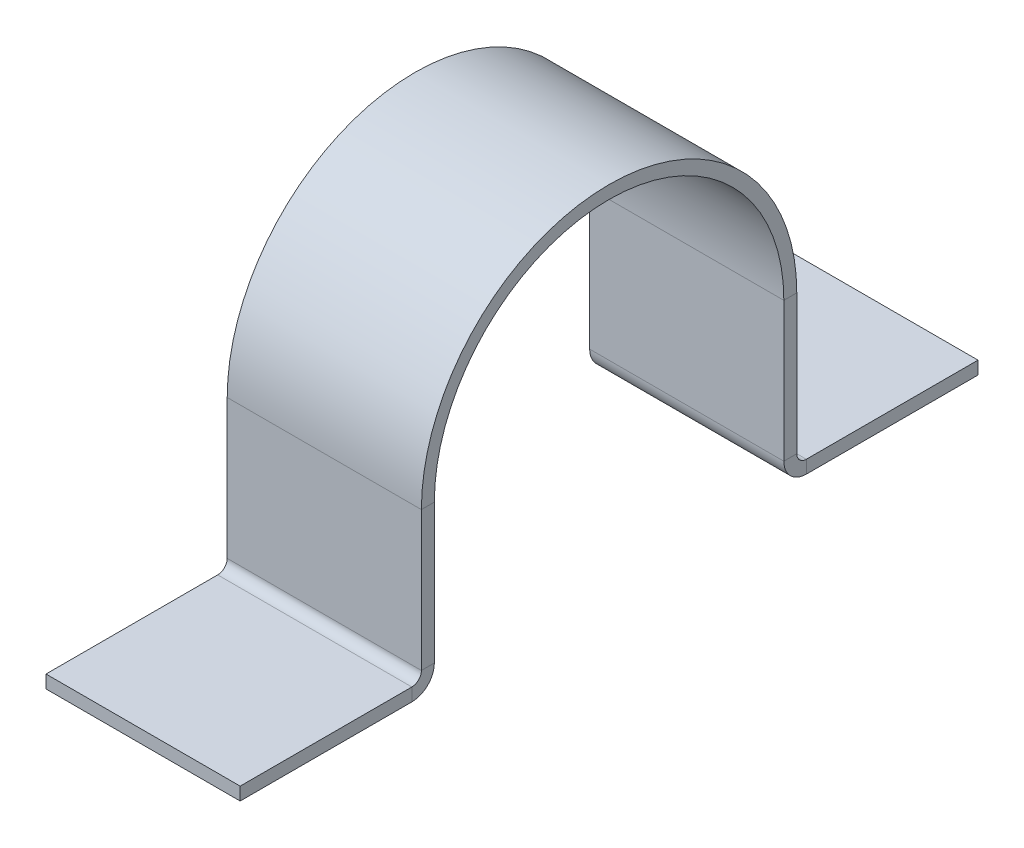
ISO-10303-21;
HEADER;
FILE_DESCRIPTION(('STEP AP214'),'2;1');
FILE_NAME('part.step','',(''),(''),'','','');
FILE_SCHEMA(('AUTOMOTIVE_DESIGN { 1 0 10303 214 1 1 1 1 }'));
ENDSEC;
DATA;
#1=APPLICATION_CONTEXT('core data for automotive mechanical design processes');
#2=APPLICATION_PROTOCOL_DEFINITION('international standard','automotive_design',2000,#1);
#3=PRODUCT_CONTEXT('',#1,'mechanical');
#4=PRODUCT('Part','Part','',(#3));
#5=PRODUCT_RELATED_PRODUCT_CATEGORY('part','',(#4));
#6=PRODUCT_DEFINITION_FORMATION('','',#4);
#7=PRODUCT_DEFINITION_CONTEXT('part definition',#1,'design');
#8=PRODUCT_DEFINITION('design','',#6,#7);
#9=PRODUCT_DEFINITION_SHAPE('','',#8);
#10=(LENGTH_UNIT() NAMED_UNIT(*) SI_UNIT(.MILLI.,.METRE.));
#11=(NAMED_UNIT(*) PLANE_ANGLE_UNIT() SI_UNIT($,.RADIAN.));
#12=(NAMED_UNIT(*) SI_UNIT($,.STERADIAN.) SOLID_ANGLE_UNIT());
#13=UNCERTAINTY_MEASURE_WITH_UNIT(LENGTH_MEASURE(1.E-05),#10,'distance_accuracy_value','');
#14=(GEOMETRIC_REPRESENTATION_CONTEXT(3) GLOBAL_UNCERTAINTY_ASSIGNED_CONTEXT((#13)) GLOBAL_UNIT_ASSIGNED_CONTEXT((#10,
#11,#12)) REPRESENTATION_CONTEXT('',''));
#15=CARTESIAN_POINT('',(0.,0.,0.));
#16=DIRECTION('',(0.,0.,1.));
#17=DIRECTION('',(1.,0.,0.));
#18=AXIS2_PLACEMENT_3D('',#15,#16,#17);
#19=CARTESIAN_POINT('',(7.5,4.57447073562823,10.5864398248652));
#20=DIRECTION('',(1.,0.,0.));
#21=DIRECTION('',(0.,0.,-1.));
#22=AXIS2_PLACEMENT_3D('',#19,#20,#21);
#23=PLANE('',#22);
#24=DIRECTION('',(0.,0.,1.));
#25=VECTOR('',#24,1.);
#26=CARTESIAN_POINT('',(7.5,4.57447073562823,10.5864398248652));
#27=LINE('',#26,#25);
#28=CARTESIAN_POINT('',(7.5,4.57447073562823,10.5864398248652));
#29=VERTEX_POINT('',#28);
#30=CARTESIAN_POINT('',(7.5,4.57447073562823,11.5864398248652));
#31=VERTEX_POINT('',#30);
#32=EDGE_CURVE('E11',#29,#31,#27,.T.);
#33=ORIENTED_EDGE('',*,*,#32,.F.);
#34=CARTESIAN_POINT('',(7.5,4.57447073562823,-2.91356017513478));
#35=DIRECTION('',(-1.,0.,0.));
#36=DIRECTION('',(0.,0.,1.));
#37=AXIS2_PLACEMENT_3D('',#34,#35,#36);
#38=CIRCLE('',#37,13.5);
#39=CARTESIAN_POINT('',(7.5,4.57447073562823,-16.4135601751348));
#40=VERTEX_POINT('',#39);
#41=EDGE_CURVE('E175',#29,#40,#38,.T.);
#42=ORIENTED_EDGE('',*,*,#41,.T.);
#43=DIRECTION('',(0.,0.,1.));
#44=VECTOR('',#43,1.);
#45=CARTESIAN_POINT('',(7.5,4.57447073562823,-17.4135601751348));
#46=LINE('',#45,#44);
#47=CARTESIAN_POINT('',(7.5,4.57447073562823,-17.4135601751348));
#48=VERTEX_POINT('',#47);
#49=EDGE_CURVE('E49',#48,#40,#46,.T.);
#50=ORIENTED_EDGE('',*,*,#49,.F.);
#51=CARTESIAN_POINT('',(7.5,4.57447073562823,-2.91356017513478));
#52=DIRECTION('',(1.,0.,0.));
#53=DIRECTION('',(0.,0.,-1.));
#54=AXIS2_PLACEMENT_3D('',#51,#52,#53);
#55=CIRCLE('',#54,14.5);
#56=EDGE_CURVE('E301',#31,#48,#55,.F.);
#57=ORIENTED_EDGE('',*,*,#56,.F.);
#58=EDGE_LOOP('',(#33,#42,#50,#57));
#59=FACE_BOUND('',#58,.T.);
#60=ADVANCED_FACE('F41',(#59),#23,.T.);
#61=CARTESIAN_POINT('',(7.5,4.57447073562823,-17.4135601751348));
#62=DIRECTION('',(1.,0.,0.));
#63=DIRECTION('',(0.,0.,-1.));
#64=AXIS2_PLACEMENT_3D('',#61,#62,#63);
#65=PLANE('',#64);
#66=DIRECTION('',(0.,1.,0.));
#67=VECTOR('',#66,1.);
#68=CARTESIAN_POINT('',(7.5,4.57447073562823,10.5864398248652));
#69=LINE('',#68,#67);
#70=CARTESIAN_POINT('',(7.5,-6.18892926437177,10.5864398248652));
#71=VERTEX_POINT('',#70);
#72=EDGE_CURVE('E180',#71,#29,#69,.T.);
#73=ORIENTED_EDGE('',*,*,#72,.T.);
#74=ORIENTED_EDGE('',*,*,#32,.T.);
#75=DIRECTION('',(0.,1.,0.));
#76=VECTOR('',#75,1.);
#77=CARTESIAN_POINT('',(7.5,4.57447073562823,11.5864398248652));
#78=LINE('',#77,#76);
#79=CARTESIAN_POINT('',(7.5,-6.18892926437177,11.5864398248652));
#80=VERTEX_POINT('',#79);
#81=EDGE_CURVE('E315',#80,#31,#78,.T.);
#82=ORIENTED_EDGE('',*,*,#81,.F.);
#83=DIRECTION('',(0.,0.,-1.));
#84=VECTOR('',#83,1.);
#85=CARTESIAN_POINT('',(7.5,-6.18892926437177,11.5864398248652));
#86=LINE('',#85,#84);
#87=EDGE_CURVE('E288',#80,#71,#86,.T.);
#88=ORIENTED_EDGE('',*,*,#87,.T.);
#89=EDGE_LOOP('',(#73,#74,#82,#88));
#90=FACE_BOUND('',#89,.T.);
#91=ADVANCED_FACE('F339',(#90),#65,.T.);
#92=CARTESIAN_POINT('',(-7.5,4.57447073562823,-16.4135601751348));
#93=DIRECTION('',(-1.,0.,0.));
#94=DIRECTION('',(0.,0.,1.));
#95=AXIS2_PLACEMENT_3D('',#92,#93,#94);
#96=PLANE('',#95);
#97=DIRECTION('',(0.,0.,-1.));
#98=VECTOR('',#97,1.);
#99=CARTESIAN_POINT('',(-7.5,4.57447073562823,-16.4135601751348));
#100=LINE('',#99,#98);
#101=CARTESIAN_POINT('',(-7.5,4.57447073562823,-16.4135601751348));
#102=VERTEX_POINT('',#101);
#103=CARTESIAN_POINT('',(-7.5,4.57447073562823,-17.4135601751348));
#104=VERTEX_POINT('',#103);
#105=EDGE_CURVE('E173',#102,#104,#100,.T.);
#106=ORIENTED_EDGE('',*,*,#105,.F.);
#107=CARTESIAN_POINT('',(-7.5,4.57447073562823,-2.91356017513478));
#108=DIRECTION('',(-1.,0.,0.));
#109=DIRECTION('',(0.,0.,1.));
#110=AXIS2_PLACEMENT_3D('',#107,#108,#109);
#111=CIRCLE('',#110,13.5);
#112=CARTESIAN_POINT('',(-7.5,4.57447073562823,10.5864398248652));
#113=VERTEX_POINT('',#112);
#114=EDGE_CURVE('E187',#113,#102,#111,.T.);
#115=ORIENTED_EDGE('',*,*,#114,.F.);
#116=DIRECTION('',(0.,0.,-1.));
#117=VECTOR('',#116,1.);
#118=CARTESIAN_POINT('',(-7.5,4.57447073562823,11.5864398248652));
#119=LINE('',#118,#117);
#120=CARTESIAN_POINT('',(-7.5,4.57447073562823,11.5864398248652));
#121=VERTEX_POINT('',#120);
#122=EDGE_CURVE('E292',#121,#113,#119,.T.);
#123=ORIENTED_EDGE('',*,*,#122,.F.);
#124=CARTESIAN_POINT('',(-7.5,4.57447073562823,-2.91356017513478));
#125=DIRECTION('',(1.,0.,0.));
#126=DIRECTION('',(0.,0.,-1.));
#127=AXIS2_PLACEMENT_3D('',#124,#125,#126);
#128=CIRCLE('',#127,14.5);
#129=EDGE_CURVE('E214',#121,#104,#128,.F.);
#130=ORIENTED_EDGE('',*,*,#129,.T.);
#131=EDGE_LOOP('',(#106,#115,#123,#130));
#132=FACE_BOUND('',#131,.T.);
#133=ADVANCED_FACE('F306',(#132),#96,.T.);
#134=CARTESIAN_POINT('',(-7.5,4.57447073562823,11.5864398248652));
#135=DIRECTION('',(-1.,0.,0.));
#136=DIRECTION('',(0.,0.,1.));
#137=AXIS2_PLACEMENT_3D('',#134,#135,#136);
#138=PLANE('',#137);
#139=DIRECTION('',(0.,-1.,0.));
#140=VECTOR('',#139,1.);
#141=CARTESIAN_POINT('',(-7.5,4.57447073562823,-16.4135601751348));
#142=LINE('',#141,#140);
#143=CARTESIAN_POINT('',(-7.5,-6.18892926437177,-16.4135601751348));
#144=VERTEX_POINT('',#143);
#145=EDGE_CURVE('E239',#102,#144,#142,.T.);
#146=ORIENTED_EDGE('',*,*,#145,.F.);
#147=ORIENTED_EDGE('',*,*,#105,.T.);
#148=DIRECTION('',(0.,-1.,0.));
#149=VECTOR('',#148,1.);
#150=CARTESIAN_POINT('',(-7.5,4.57447073562823,-17.4135601751348));
#151=LINE('',#150,#149);
#152=CARTESIAN_POINT('',(-7.5,-6.18892926437177,-17.4135601751348));
#153=VERTEX_POINT('',#152);
#154=EDGE_CURVE('E212',#104,#153,#151,.T.);
#155=ORIENTED_EDGE('',*,*,#154,.T.);
#156=DIRECTION('',(0.,0.,1.));
#157=VECTOR('',#156,1.);
#158=CARTESIAN_POINT('',(-7.5,-6.18892926437177,-17.4135601751348));
#159=LINE('',#158,#157);
#160=EDGE_CURVE('E110',#153,#144,#159,.T.);
#161=ORIENTED_EDGE('',*,*,#160,.T.);
#162=EDGE_LOOP('',(#146,#147,#155,#161));
#163=FACE_BOUND('',#162,.T.);
#164=ADVANCED_FACE('F294',(#163),#138,.T.);
#165=CARTESIAN_POINT('',(7.5,-7.92552926437177,12.3230398248652));
#166=DIRECTION('',(1.,0.,0.));
#167=DIRECTION('',(0.,0.,-1.));
#168=AXIS2_PLACEMENT_3D('',#165,#166,#167);
#169=PLANE('',#168);
#170=DIRECTION('',(0.,1.,0.));
#171=VECTOR('',#170,1.);
#172=CARTESIAN_POINT('',(7.5,-7.92552926437177,12.3230398248652));
#173=LINE('',#172,#171);
#174=CARTESIAN_POINT('',(7.5,-7.92552926437177,12.3230398248652));
#175=VERTEX_POINT('',#174);
#176=CARTESIAN_POINT('',(7.5,-6.92552926437177,12.3230398248652));
#177=VERTEX_POINT('',#176);
#178=EDGE_CURVE('E290',#175,#177,#173,.T.);
#179=ORIENTED_EDGE('',*,*,#178,.F.);
#180=CARTESIAN_POINT('',(7.5,-6.18892926437177,12.3230398248652));
#181=DIRECTION('',(-1.,0.,0.));
#182=DIRECTION('',(0.,0.,1.));
#183=AXIS2_PLACEMENT_3D('',#180,#181,#182);
#184=CIRCLE('',#183,1.7366);
#185=EDGE_CURVE('E334',#175,#71,#184,.F.);
#186=ORIENTED_EDGE('',*,*,#185,.T.);
#187=ORIENTED_EDGE('',*,*,#87,.F.);
#188=CARTESIAN_POINT('',(7.5,-6.18892926437177,12.3230398248652));
#189=DIRECTION('',(1.,0.,0.));
#190=DIRECTION('',(0.,0.,-1.));
#191=AXIS2_PLACEMENT_3D('',#188,#189,#190);
#192=CIRCLE('',#191,0.7366);
#193=EDGE_CURVE('E317',#177,#80,#192,.T.);
#194=ORIENTED_EDGE('',*,*,#193,.F.);
#195=EDGE_LOOP('',(#179,#186,#187,#194));
#196=FACE_BOUND('',#195,.T.);
#197=ADVANCED_FACE('F352',(#196),#169,.T.);
#198=CARTESIAN_POINT('',(7.5,-6.18892926437177,11.5864398248652));
#199=DIRECTION('',(1.,0.,0.));
#200=DIRECTION('',(0.,0.,-1.));
#201=AXIS2_PLACEMENT_3D('',#198,#199,#200);
#202=PLANE('',#201);
#203=DIRECTION('',(0.,0.,-1.));
#204=VECTOR('',#203,1.);
#205=CARTESIAN_POINT('',(7.5,-7.92552926437177,10.5864398248652));
#206=LINE('',#205,#204);
#207=CARTESIAN_POINT('',(7.5,-7.92552926437178,25.5864398248652));
#208=VERTEX_POINT('',#207);
#209=EDGE_CURVE('E331',#208,#175,#206,.T.);
#210=ORIENTED_EDGE('',*,*,#209,.T.);
#211=ORIENTED_EDGE('',*,*,#178,.T.);
#212=DIRECTION('',(0.,0.,-1.));
#213=VECTOR('',#212,1.);
#214=CARTESIAN_POINT('',(7.5,-6.92552926437177,10.5864398248652));
#215=LINE('',#214,#213);
#216=CARTESIAN_POINT('',(7.5,-6.92552926437178,25.5864398248652));
#217=VERTEX_POINT('',#216);
#218=EDGE_CURVE('E325',#217,#177,#215,.T.);
#219=ORIENTED_EDGE('',*,*,#218,.F.);
#220=DIRECTION('',(0.,1.,0.));
#221=VECTOR('',#220,1.);
#222=CARTESIAN_POINT('',(7.5,-7.92552926437178,25.5864398248652));
#223=LINE('',#222,#221);
#224=EDGE_CURVE('E328',#208,#217,#223,.T.);
#225=ORIENTED_EDGE('',*,*,#224,.F.);
#226=EDGE_LOOP('',(#210,#211,#219,#225));
#227=FACE_BOUND('',#226,.T.);
#228=ADVANCED_FACE('F359',(#227),#202,.T.);
#229=CARTESIAN_POINT('',(-7.5,-6.18892926437177,10.5864398248652));
#230=DIRECTION('',(-1.,0.,0.));
#231=DIRECTION('',(0.,0.,1.));
#232=AXIS2_PLACEMENT_3D('',#229,#230,#231);
#233=PLANE('',#232);
#234=DIRECTION('',(0.,0.,1.));
#235=VECTOR('',#234,1.);
#236=CARTESIAN_POINT('',(-7.5,-6.18892926437177,10.5864398248652));
#237=LINE('',#236,#235);
#238=CARTESIAN_POINT('',(-7.5,-6.18892926437177,10.5864398248652));
#239=VERTEX_POINT('',#238);
#240=CARTESIAN_POINT('',(-7.5,-6.18892926437177,11.5864398248652));
#241=VERTEX_POINT('',#240);
#242=EDGE_CURVE('E286',#239,#241,#237,.T.);
#243=ORIENTED_EDGE('',*,*,#242,.F.);
#244=CARTESIAN_POINT('',(-7.5,-6.18892926437177,12.3230398248652));
#245=DIRECTION('',(-1.,0.,0.));
#246=DIRECTION('',(0.,0.,1.));
#247=AXIS2_PLACEMENT_3D('',#244,#245,#246);
#248=CIRCLE('',#247,1.7366);
#249=CARTESIAN_POINT('',(-7.5,-7.92552926437177,12.3230398248652));
#250=VERTEX_POINT('',#249);
#251=EDGE_CURVE('E232',#250,#239,#248,.F.);
#252=ORIENTED_EDGE('',*,*,#251,.F.);
#253=DIRECTION('',(0.,-1.,0.));
#254=VECTOR('',#253,1.);
#255=CARTESIAN_POINT('',(-7.5,-6.92552926437177,12.3230398248652));
#256=LINE('',#255,#254);
#257=CARTESIAN_POINT('',(-7.5,-6.92552926437177,12.3230398248652));
#258=VERTEX_POINT('',#257);
#259=EDGE_CURVE('E284',#258,#250,#256,.T.);
#260=ORIENTED_EDGE('',*,*,#259,.F.);
#261=CARTESIAN_POINT('',(-7.5,-6.18892926437177,12.3230398248652));
#262=DIRECTION('',(1.,0.,0.));
#263=DIRECTION('',(0.,0.,-1.));
#264=AXIS2_PLACEMENT_3D('',#261,#262,#263);
#265=CIRCLE('',#264,0.7366);
#266=EDGE_CURVE('E220',#258,#241,#265,.T.);
#267=ORIENTED_EDGE('',*,*,#266,.T.);
#268=EDGE_LOOP('',(#243,#252,#260,#267));
#269=FACE_BOUND('',#268,.T.);
#270=ADVANCED_FACE('F371',(#269),#233,.T.);
#271=CARTESIAN_POINT('',(-7.5,-6.92552926437177,12.3230398248652));
#272=DIRECTION('',(-1.,0.,0.));
#273=DIRECTION('',(0.,0.,1.));
#274=AXIS2_PLACEMENT_3D('',#271,#272,#273);
#275=PLANE('',#274);
#276=DIRECTION('',(0.,1.,0.));
#277=VECTOR('',#276,1.);
#278=CARTESIAN_POINT('',(-7.5,4.57447073562823,10.5864398248652));
#279=LINE('',#278,#277);
#280=EDGE_CURVE('E235',#239,#113,#279,.T.);
#281=ORIENTED_EDGE('',*,*,#280,.F.);
#282=ORIENTED_EDGE('',*,*,#242,.T.);
#283=DIRECTION('',(0.,1.,0.));
#284=VECTOR('',#283,1.);
#285=CARTESIAN_POINT('',(-7.5,4.57447073562823,11.5864398248652));
#286=LINE('',#285,#284);
#287=EDGE_CURVE('E217',#241,#121,#286,.T.);
#288=ORIENTED_EDGE('',*,*,#287,.T.);
#289=ORIENTED_EDGE('',*,*,#122,.T.);
#290=EDGE_LOOP('',(#281,#282,#288,#289));
#291=FACE_BOUND('',#290,.T.);
#292=ADVANCED_FACE('F343',(#291),#275,.T.);
#293=CARTESIAN_POINT('',(7.5,-6.18892926437177,-16.4135601751348));
#294=DIRECTION('',(1.,0.,0.));
#295=DIRECTION('',(0.,0.,-1.));
#296=AXIS2_PLACEMENT_3D('',#293,#294,#295);
#297=PLANE('',#296);
#298=DIRECTION('',(0.,0.,-1.));
#299=VECTOR('',#298,1.);
#300=CARTESIAN_POINT('',(7.5,-6.18892926437177,-16.4135601751348));
#301=LINE('',#300,#299);
#302=CARTESIAN_POINT('',(7.5,-6.18892926437177,-16.4135601751348));
#303=VERTEX_POINT('',#302);
#304=CARTESIAN_POINT('',(7.5,-6.18892926437177,-17.4135601751348));
#305=VERTEX_POINT('',#304);
#306=EDGE_CURVE('E282',#303,#305,#301,.T.);
#307=ORIENTED_EDGE('',*,*,#306,.F.);
#308=CARTESIAN_POINT('',(7.5,-6.18892926437177,-18.1501601751348));
#309=DIRECTION('',(-1.,0.,0.));
#310=DIRECTION('',(0.,0.,1.));
#311=AXIS2_PLACEMENT_3D('',#308,#309,#310);
#312=CIRCLE('',#311,1.7366);
#313=CARTESIAN_POINT('',(7.5,-7.92552926437177,-18.1501601751348));
#314=VERTEX_POINT('',#313);
#315=EDGE_CURVE('E195',#303,#314,#312,.F.);
#316=ORIENTED_EDGE('',*,*,#315,.T.);
#317=DIRECTION('',(0.,-1.,0.));
#318=VECTOR('',#317,1.);
#319=CARTESIAN_POINT('',(7.5,-6.92552926437177,-18.1501601751348));
#320=LINE('',#319,#318);
#321=CARTESIAN_POINT('',(7.5,-6.92552926437177,-18.1501601751348));
#322=VERTEX_POINT('',#321);
#323=EDGE_CURVE('E57',#322,#314,#320,.T.);
#324=ORIENTED_EDGE('',*,*,#323,.F.);
#325=CARTESIAN_POINT('',(7.5,-6.18892926437177,-18.1501601751348));
#326=DIRECTION('',(1.,0.,0.));
#327=DIRECTION('',(0.,0.,-1.));
#328=AXIS2_PLACEMENT_3D('',#325,#326,#327);
#329=CIRCLE('',#328,0.7366);
#330=EDGE_CURVE('E319',#305,#322,#329,.T.);
#331=ORIENTED_EDGE('',*,*,#330,.F.);
#332=EDGE_LOOP('',(#307,#316,#324,#331));
#333=FACE_BOUND('',#332,.T.);
#334=ADVANCED_FACE('F402',(#333),#297,.T.);
#335=CARTESIAN_POINT('',(7.5,-6.92552926437177,-18.1501601751348));
#336=DIRECTION('',(1.,0.,0.));
#337=DIRECTION('',(0.,0.,-1.));
#338=AXIS2_PLACEMENT_3D('',#335,#336,#337);
#339=PLANE('',#338);
#340=DIRECTION('',(0.,-1.,0.));
#341=VECTOR('',#340,1.);
#342=CARTESIAN_POINT('',(7.5,4.57447073562823,-16.4135601751348));
#343=LINE('',#342,#341);
#344=EDGE_CURVE('E165',#40,#303,#343,.T.);
#345=ORIENTED_EDGE('',*,*,#344,.T.);
#346=ORIENTED_EDGE('',*,*,#306,.T.);
#347=DIRECTION('',(0.,-1.,0.));
#348=VECTOR('',#347,1.);
#349=CARTESIAN_POINT('',(7.5,4.57447073562823,-17.4135601751348));
#350=LINE('',#349,#348);
#351=EDGE_CURVE('E168',#48,#305,#350,.T.);
#352=ORIENTED_EDGE('',*,*,#351,.F.);
#353=ORIENTED_EDGE('',*,*,#49,.T.);
#354=EDGE_LOOP('',(#345,#346,#352,#353));
#355=FACE_BOUND('',#354,.T.);
#356=ADVANCED_FACE('F163',(#355),#339,.T.);
#357=CARTESIAN_POINT('',(-7.5,-7.92552926437177,-18.1501601751348));
#358=DIRECTION('',(-1.,0.,0.));
#359=DIRECTION('',(0.,0.,1.));
#360=AXIS2_PLACEMENT_3D('',#357,#358,#359);
#361=PLANE('',#360);
#362=DIRECTION('',(0.,1.,0.));
#363=VECTOR('',#362,1.);
#364=CARTESIAN_POINT('',(-7.5,-7.92552926437177,-18.1501601751348));
#365=LINE('',#364,#363);
#366=CARTESIAN_POINT('',(-7.5,-7.92552926437177,-18.1501601751348));
#367=VERTEX_POINT('',#366);
#368=CARTESIAN_POINT('',(-7.5,-6.92552926437177,-18.1501601751348));
#369=VERTEX_POINT('',#368);
#370=EDGE_CURVE('E117',#367,#369,#365,.T.);
#371=ORIENTED_EDGE('',*,*,#370,.F.);
#372=CARTESIAN_POINT('',(-7.5,-6.18892926437177,-18.1501601751348));
#373=DIRECTION('',(-1.,0.,0.));
#374=DIRECTION('',(0.,0.,1.));
#375=AXIS2_PLACEMENT_3D('',#372,#373,#374);
#376=CIRCLE('',#375,1.7366);
#377=EDGE_CURVE('E241',#144,#367,#376,.F.);
#378=ORIENTED_EDGE('',*,*,#377,.F.);
#379=ORIENTED_EDGE('',*,*,#160,.F.);
#380=CARTESIAN_POINT('',(-7.5,-6.18892926437177,-18.1501601751348));
#381=DIRECTION('',(1.,0.,0.));
#382=DIRECTION('',(0.,0.,-1.));
#383=AXIS2_PLACEMENT_3D('',#380,#381,#382);
#384=CIRCLE('',#383,0.7366);
#385=EDGE_CURVE('E210',#153,#369,#384,.T.);
#386=ORIENTED_EDGE('',*,*,#385,.T.);
#387=EDGE_LOOP('',(#371,#378,#379,#386));
#388=FACE_BOUND('',#387,.T.);
#389=ADVANCED_FACE('F408',(#388),#361,.T.);
#390=CARTESIAN_POINT('',(-7.5,-6.18892926437177,-17.4135601751348));
#391=DIRECTION('',(-1.,0.,0.));
#392=DIRECTION('',(0.,0.,1.));
#393=AXIS2_PLACEMENT_3D('',#390,#391,#392);
#394=PLANE('',#393);
#395=DIRECTION('',(0.,0.,-1.));
#396=VECTOR('',#395,1.);
#397=CARTESIAN_POINT('',(-7.5,-7.92552926437177,-16.4135601751348));
#398=LINE('',#397,#396);
#399=CARTESIAN_POINT('',(-7.5,-7.92552926437177,-31.4135601751348));
#400=VERTEX_POINT('',#399);
#401=EDGE_CURVE('E201',#367,#400,#398,.T.);
#402=ORIENTED_EDGE('',*,*,#401,.F.);
#403=ORIENTED_EDGE('',*,*,#370,.T.);
#404=DIRECTION('',(0.,0.,-1.));
#405=VECTOR('',#404,1.);
#406=CARTESIAN_POINT('',(-7.5,-6.92552926437177,-16.4135601751348));
#407=LINE('',#406,#405);
#408=CARTESIAN_POINT('',(-7.5,-6.92552926437177,-31.4135601751348));
#409=VERTEX_POINT('',#408);
#410=EDGE_CURVE('E207',#369,#409,#407,.T.);
#411=ORIENTED_EDGE('',*,*,#410,.T.);
#412=DIRECTION('',(0.,-1.,0.));
#413=VECTOR('',#412,1.);
#414=CARTESIAN_POINT('',(-7.5,-6.92552926437177,-31.4135601751348));
#415=LINE('',#414,#413);
#416=EDGE_CURVE('E204',#409,#400,#415,.T.);
#417=ORIENTED_EDGE('',*,*,#416,.T.);
#418=EDGE_LOOP('',(#402,#403,#411,#417));
#419=FACE_BOUND('',#418,.T.);
#420=ADVANCED_FACE('F411',(#419),#394,.T.);
#421=CARTESIAN_POINT('',(7.5,-7.92552926437177,-16.4135601751348));
#422=DIRECTION('',(0.,1.,0.));
#423=DIRECTION('',(0.,0.,1.));
#424=AXIS2_PLACEMENT_3D('',#421,#422,#423);
#425=PLANE('',#424);
#426=ORIENTED_EDGE('',*,*,#401,.T.);
#427=DIRECTION('',(-1.,0.,0.));
#428=VECTOR('',#427,1.);
#429=CARTESIAN_POINT('',(7.5,-7.92552926437177,-31.4135601751348));
#430=LINE('',#429,#428);
#431=CARTESIAN_POINT('',(7.5,-7.92552926437177,-31.4135601751348));
#432=VERTEX_POINT('',#431);
#433=EDGE_CURVE('E277',#432,#400,#430,.T.);
#434=ORIENTED_EDGE('',*,*,#433,.F.);
#435=DIRECTION('',(0.,0.,-1.));
#436=VECTOR('',#435,1.);
#437=CARTESIAN_POINT('',(7.5,-7.92552926437177,-16.4135601751348));
#438=LINE('',#437,#436);
#439=EDGE_CURVE('E123',#314,#432,#438,.T.);
#440=ORIENTED_EDGE('',*,*,#439,.F.);
#441=DIRECTION('',(-1.,0.,0.));
#442=VECTOR('',#441,1.);
#443=CARTESIAN_POINT('',(7.5,-7.92552926437177,-18.1501601751348));
#444=LINE('',#443,#442);
#445=EDGE_CURVE('E197',#314,#367,#444,.T.);
#446=ORIENTED_EDGE('',*,*,#445,.T.);
#447=EDGE_LOOP('',(#426,#434,#440,#446));
#448=FACE_BOUND('',#447,.T.);
#449=ADVANCED_FACE('F414',(#448),#425,.F.);
#450=CARTESIAN_POINT('',(7.5,-6.92552926437177,-31.4135601751348));
#451=DIRECTION('',(0.,0.,-1.));
#452=DIRECTION('',(-1.,0.,0.));
#453=AXIS2_PLACEMENT_3D('',#450,#451,#452);
#454=PLANE('',#453);
#455=ORIENTED_EDGE('',*,*,#416,.F.);
#456=DIRECTION('',(-1.,0.,0.));
#457=VECTOR('',#456,1.);
#458=CARTESIAN_POINT('',(7.5,-6.92552926437177,-31.4135601751348));
#459=LINE('',#458,#457);
#460=CARTESIAN_POINT('',(7.5,-6.92552926437177,-31.4135601751348));
#461=VERTEX_POINT('',#460);
#462=EDGE_CURVE('E275',#461,#409,#459,.T.);
#463=ORIENTED_EDGE('',*,*,#462,.F.);
#464=DIRECTION('',(0.,-1.,0.));
#465=VECTOR('',#464,1.);
#466=CARTESIAN_POINT('',(7.5,-6.92552926437177,-31.4135601751348));
#467=LINE('',#466,#465);
#468=EDGE_CURVE('E461',#461,#432,#467,.T.);
#469=ORIENTED_EDGE('',*,*,#468,.T.);
#470=ORIENTED_EDGE('',*,*,#433,.T.);
#471=EDGE_LOOP('',(#455,#463,#469,#470));
#472=FACE_BOUND('',#471,.T.);
#473=ADVANCED_FACE('F418',(#472),#454,.T.);
#474=CARTESIAN_POINT('',(7.5,-6.92552926437177,-16.4135601751348));
#475=DIRECTION('',(0.,1.,0.));
#476=DIRECTION('',(0.,0.,1.));
#477=AXIS2_PLACEMENT_3D('',#474,#475,#476);
#478=PLANE('',#477);
#479=ORIENTED_EDGE('',*,*,#410,.F.);
#480=DIRECTION('',(-1.,0.,0.));
#481=VECTOR('',#480,1.);
#482=CARTESIAN_POINT('',(7.5,-6.92552926437177,-18.1501601751348));
#483=LINE('',#482,#481);
#484=EDGE_CURVE('E272',#322,#369,#483,.T.);
#485=ORIENTED_EDGE('',*,*,#484,.F.);
#486=DIRECTION('',(0.,0.,-1.));
#487=VECTOR('',#486,1.);
#488=CARTESIAN_POINT('',(7.5,-6.92552926437177,-16.4135601751348));
#489=LINE('',#488,#487);
#490=EDGE_CURVE('E463',#322,#461,#489,.T.);
#491=ORIENTED_EDGE('',*,*,#490,.T.);
#492=ORIENTED_EDGE('',*,*,#462,.T.);
#493=EDGE_LOOP('',(#479,#485,#491,#492));
#494=FACE_BOUND('',#493,.T.);
#495=ADVANCED_FACE('F422',(#494),#478,.T.);
#496=CARTESIAN_POINT('',(7.5,-6.18892926437177,-18.1501601751348));
#497=DIRECTION('',(-1.,0.,0.));
#498=DIRECTION('',(0.,0.,1.));
#499=AXIS2_PLACEMENT_3D('',#496,#497,#498);
#500=CYLINDRICAL_SURFACE('',#499,0.7366);
#501=ORIENTED_EDGE('',*,*,#385,.F.);
#502=DIRECTION('',(-1.,0.,0.));
#503=VECTOR('',#502,1.);
#504=CARTESIAN_POINT('',(7.5,-6.18892926437177,-17.4135601751348));
#505=LINE('',#504,#503);
#506=EDGE_CURVE('E269',#305,#153,#505,.T.);
#507=ORIENTED_EDGE('',*,*,#506,.F.);
#508=ORIENTED_EDGE('',*,*,#330,.T.);
#509=ORIENTED_EDGE('',*,*,#484,.T.);
#510=EDGE_LOOP('',(#501,#507,#508,#509));
#511=FACE_BOUND('',#510,.T.);
#512=ADVANCED_FACE('F426',(#511),#500,.F.);
#513=CARTESIAN_POINT('',(7.5,4.57447073562823,-17.4135601751348));
#514=DIRECTION('',(0.,0.,-1.));
#515=DIRECTION('',(0.,1.,0.));
#516=AXIS2_PLACEMENT_3D('',#513,#514,#515);
#517=PLANE('',#516);
#518=ORIENTED_EDGE('',*,*,#154,.F.);
#519=DIRECTION('',(-1.,0.,0.));
#520=VECTOR('',#519,1.);
#521=CARTESIAN_POINT('',(7.5,4.57447073562823,-17.4135601751348));
#522=LINE('',#521,#520);
#523=EDGE_CURVE('E266',#48,#104,#522,.T.);
#524=ORIENTED_EDGE('',*,*,#523,.F.);
#525=ORIENTED_EDGE('',*,*,#351,.T.);
#526=ORIENTED_EDGE('',*,*,#506,.T.);
#527=EDGE_LOOP('',(#518,#524,#525,#526));
#528=FACE_BOUND('',#527,.T.);
#529=ADVANCED_FACE('F303',(#528),#517,.T.);
#530=CARTESIAN_POINT('',(7.5,4.57447073562823,-2.91356017513478));
#531=DIRECTION('',(-1.,0.,0.));
#532=DIRECTION('',(0.,0.,1.));
#533=AXIS2_PLACEMENT_3D('',#530,#531,#532);
#534=CYLINDRICAL_SURFACE('',#533,14.5);
#535=ORIENTED_EDGE('',*,*,#129,.F.);
#536=DIRECTION('',(-1.,0.,0.));
#537=VECTOR('',#536,1.);
#538=CARTESIAN_POINT('',(7.5,4.57447073562823,11.5864398248652));
#539=LINE('',#538,#537);
#540=EDGE_CURVE('E263',#31,#121,#539,.T.);
#541=ORIENTED_EDGE('',*,*,#540,.F.);
#542=ORIENTED_EDGE('',*,*,#56,.T.);
#543=ORIENTED_EDGE('',*,*,#523,.T.);
#544=EDGE_LOOP('',(#535,#541,#542,#543));
#545=FACE_BOUND('',#544,.T.);
#546=ADVANCED_FACE('F299',(#545),#534,.T.);
#547=CARTESIAN_POINT('',(7.5,4.57447073562823,11.5864398248652));
#548=DIRECTION('',(0.,0.,1.));
#549=DIRECTION('',(1.,0.,0.));
#550=AXIS2_PLACEMENT_3D('',#547,#548,#549);
#551=PLANE('',#550);
#552=ORIENTED_EDGE('',*,*,#287,.F.);
#553=DIRECTION('',(-1.,0.,0.));
#554=VECTOR('',#553,1.);
#555=CARTESIAN_POINT('',(7.5,-6.18892926437177,11.5864398248652));
#556=LINE('',#555,#554);
#557=EDGE_CURVE('E260',#80,#241,#556,.T.);
#558=ORIENTED_EDGE('',*,*,#557,.F.);
#559=ORIENTED_EDGE('',*,*,#81,.T.);
#560=ORIENTED_EDGE('',*,*,#540,.T.);
#561=EDGE_LOOP('',(#552,#558,#559,#560));
#562=FACE_BOUND('',#561,.T.);
#563=ADVANCED_FACE('F312',(#562),#551,.T.);
#564=CARTESIAN_POINT('',(7.5,-6.18892926437177,12.3230398248652));
#565=DIRECTION('',(-1.,0.,0.));
#566=DIRECTION('',(0.,0.,1.));
#567=AXIS2_PLACEMENT_3D('',#564,#565,#566);
#568=CYLINDRICAL_SURFACE('',#567,0.7366);
#569=ORIENTED_EDGE('',*,*,#266,.F.);
#570=DIRECTION('',(-1.,0.,0.));
#571=VECTOR('',#570,1.);
#572=CARTESIAN_POINT('',(7.5,-6.92552926437177,12.3230398248652));
#573=LINE('',#572,#571);
#574=EDGE_CURVE('E257',#177,#258,#573,.T.);
#575=ORIENTED_EDGE('',*,*,#574,.F.);
#576=ORIENTED_EDGE('',*,*,#193,.T.);
#577=ORIENTED_EDGE('',*,*,#557,.T.);
#578=EDGE_LOOP('',(#569,#575,#576,#577));
#579=FACE_BOUND('',#578,.T.);
#580=ADVANCED_FACE('F348',(#579),#568,.F.);
#581=CARTESIAN_POINT('',(7.5,-6.92552926437177,10.5864398248652));
#582=DIRECTION('',(0.,1.,0.));
#583=DIRECTION('',(0.,0.,1.));
#584=AXIS2_PLACEMENT_3D('',#581,#582,#583);
#585=PLANE('',#584);
#586=DIRECTION('',(0.,0.,-1.));
#587=VECTOR('',#586,1.);
#588=CARTESIAN_POINT('',(-7.5,-6.92552926437177,10.5864398248652));
#589=LINE('',#588,#587);
#590=CARTESIAN_POINT('',(-7.5,-6.92552926437178,25.5864398248652));
#591=VERTEX_POINT('',#590);
#592=EDGE_CURVE('E223',#591,#258,#589,.T.);
#593=ORIENTED_EDGE('',*,*,#592,.F.);
#594=DIRECTION('',(-1.,0.,0.));
#595=VECTOR('',#594,1.);
#596=CARTESIAN_POINT('',(7.5,-6.92552926437178,25.5864398248652));
#597=LINE('',#596,#595);
#598=EDGE_CURVE('E255',#217,#591,#597,.T.);
#599=ORIENTED_EDGE('',*,*,#598,.F.);
#600=ORIENTED_EDGE('',*,*,#218,.T.);
#601=ORIENTED_EDGE('',*,*,#574,.T.);
#602=EDGE_LOOP('',(#593,#599,#600,#601));
#603=FACE_BOUND('',#602,.T.);
#604=ADVANCED_FACE('F356',(#603),#585,.T.);
#605=CARTESIAN_POINT('',(7.5,-7.92552926437178,25.5864398248652));
#606=DIRECTION('',(0.,0.,1.));
#607=DIRECTION('',(1.,0.,0.));
#608=AXIS2_PLACEMENT_3D('',#605,#606,#607);
#609=PLANE('',#608);
#610=DIRECTION('',(0.,1.,0.));
#611=VECTOR('',#610,1.);
#612=CARTESIAN_POINT('',(-7.5,-7.92552926437178,25.5864398248652));
#613=LINE('',#612,#611);
#614=CARTESIAN_POINT('',(-7.5,-7.92552926437178,25.5864398248652));
#615=VERTEX_POINT('',#614);
#616=EDGE_CURVE('E226',#615,#591,#613,.T.);
#617=ORIENTED_EDGE('',*,*,#616,.F.);
#618=DIRECTION('',(-1.,0.,0.));
#619=VECTOR('',#618,1.);
#620=CARTESIAN_POINT('',(7.5,-7.92552926437178,25.5864398248652));
#621=LINE('',#620,#619);
#622=EDGE_CURVE('E253',#208,#615,#621,.T.);
#623=ORIENTED_EDGE('',*,*,#622,.F.);
#624=ORIENTED_EDGE('',*,*,#224,.T.);
#625=ORIENTED_EDGE('',*,*,#598,.T.);
#626=EDGE_LOOP('',(#617,#623,#624,#625));
#627=FACE_BOUND('',#626,.T.);
#628=ADVANCED_FACE('F362',(#627),#609,.T.);
#629=CARTESIAN_POINT('',(7.5,-7.92552926437177,10.5864398248652));
#630=DIRECTION('',(0.,1.,0.));
#631=DIRECTION('',(0.,0.,1.));
#632=AXIS2_PLACEMENT_3D('',#629,#630,#631);
#633=PLANE('',#632);
#634=DIRECTION('',(0.,0.,-1.));
#635=VECTOR('',#634,1.);
#636=CARTESIAN_POINT('',(-7.5,-7.92552926437177,10.5864398248652));
#637=LINE('',#636,#635);
#638=EDGE_CURVE('E229',#615,#250,#637,.T.);
#639=ORIENTED_EDGE('',*,*,#638,.T.);
#640=DIRECTION('',(-1.,0.,0.));
#641=VECTOR('',#640,1.);
#642=CARTESIAN_POINT('',(7.5,-7.92552926437177,12.3230398248652));
#643=LINE('',#642,#641);
#644=EDGE_CURVE('E250',#175,#250,#643,.T.);
#645=ORIENTED_EDGE('',*,*,#644,.F.);
#646=ORIENTED_EDGE('',*,*,#209,.F.);
#647=ORIENTED_EDGE('',*,*,#622,.T.);
#648=EDGE_LOOP('',(#639,#645,#646,#647));
#649=FACE_BOUND('',#648,.T.);
#650=ADVANCED_FACE('F367',(#649),#633,.F.);
#651=CARTESIAN_POINT('',(7.5,-6.18892926437177,12.3230398248652));
#652=DIRECTION('',(-1.,0.,0.));
#653=DIRECTION('',(0.,0.,1.));
#654=AXIS2_PLACEMENT_3D('',#651,#652,#653);
#655=CYLINDRICAL_SURFACE('',#654,1.7366);
#656=ORIENTED_EDGE('',*,*,#251,.T.);
#657=DIRECTION('',(-1.,0.,0.));
#658=VECTOR('',#657,1.);
#659=CARTESIAN_POINT('',(7.5,-6.18892926437177,10.5864398248652));
#660=LINE('',#659,#658);
#661=EDGE_CURVE('E247',#71,#239,#660,.T.);
#662=ORIENTED_EDGE('',*,*,#661,.F.);
#663=ORIENTED_EDGE('',*,*,#185,.F.);
#664=ORIENTED_EDGE('',*,*,#644,.T.);
#665=EDGE_LOOP('',(#656,#662,#663,#664));
#666=FACE_BOUND('',#665,.T.);
#667=ADVANCED_FACE('F370',(#666),#655,.T.);
#668=CARTESIAN_POINT('',(7.5,4.57447073562823,10.5864398248652));
#669=DIRECTION('',(0.,0.,1.));
#670=DIRECTION('',(1.,0.,0.));
#671=AXIS2_PLACEMENT_3D('',#668,#669,#670);
#672=PLANE('',#671);
#673=ORIENTED_EDGE('',*,*,#280,.T.);
#674=DIRECTION('',(-1.,0.,0.));
#675=VECTOR('',#674,1.);
#676=CARTESIAN_POINT('',(7.5,4.57447073562823,10.5864398248652));
#677=LINE('',#676,#675);
#678=EDGE_CURVE('E189',#29,#113,#677,.T.);
#679=ORIENTED_EDGE('',*,*,#678,.F.);
#680=ORIENTED_EDGE('',*,*,#72,.F.);
#681=ORIENTED_EDGE('',*,*,#661,.T.);
#682=EDGE_LOOP('',(#673,#679,#680,#681));
#683=FACE_BOUND('',#682,.T.);
#684=ADVANCED_FACE('F341',(#683),#672,.F.);
#685=CARTESIAN_POINT('',(7.5,4.57447073562823,-2.91356017513478));
#686=DIRECTION('',(-1.,0.,0.));
#687=DIRECTION('',(0.,0.,1.));
#688=AXIS2_PLACEMENT_3D('',#685,#686,#687);
#689=CYLINDRICAL_SURFACE('',#688,13.5);
#690=ORIENTED_EDGE('',*,*,#114,.T.);
#691=DIRECTION('',(-1.,0.,0.));
#692=VECTOR('',#691,1.);
#693=CARTESIAN_POINT('',(7.5,4.57447073562823,-16.4135601751348));
#694=LINE('',#693,#692);
#695=EDGE_CURVE('E184',#40,#102,#694,.T.);
#696=ORIENTED_EDGE('',*,*,#695,.F.);
#697=ORIENTED_EDGE('',*,*,#41,.F.);
#698=ORIENTED_EDGE('',*,*,#678,.T.);
#699=EDGE_LOOP('',(#690,#696,#697,#698));
#700=FACE_BOUND('',#699,.T.);
#701=ADVANCED_FACE('F185',(#700),#689,.F.);
#702=CARTESIAN_POINT('',(7.5,4.57447073562823,-16.4135601751348));
#703=DIRECTION('',(0.,0.,-1.));
#704=DIRECTION('',(0.,1.,0.));
#705=AXIS2_PLACEMENT_3D('',#702,#703,#704);
#706=PLANE('',#705);
#707=ORIENTED_EDGE('',*,*,#145,.T.);
#708=DIRECTION('',(-1.,0.,0.));
#709=VECTOR('',#708,1.);
#710=CARTESIAN_POINT('',(7.5,-6.18892926437177,-16.4135601751348));
#711=LINE('',#710,#709);
#712=EDGE_CURVE('E190',#303,#144,#711,.T.);
#713=ORIENTED_EDGE('',*,*,#712,.F.);
#714=ORIENTED_EDGE('',*,*,#344,.F.);
#715=ORIENTED_EDGE('',*,*,#695,.T.);
#716=EDGE_LOOP('',(#707,#713,#714,#715));
#717=FACE_BOUND('',#716,.T.);
#718=ADVANCED_FACE('F192',(#717),#706,.F.);
#719=CARTESIAN_POINT('',(7.5,-6.18892926437177,-18.1501601751348));
#720=DIRECTION('',(-1.,0.,0.));
#721=DIRECTION('',(0.,0.,1.));
#722=AXIS2_PLACEMENT_3D('',#719,#720,#721);
#723=CYLINDRICAL_SURFACE('',#722,1.7366);
#724=ORIENTED_EDGE('',*,*,#377,.T.);
#725=ORIENTED_EDGE('',*,*,#445,.F.);
#726=ORIENTED_EDGE('',*,*,#315,.F.);
#727=ORIENTED_EDGE('',*,*,#712,.T.);
#728=EDGE_LOOP('',(#724,#725,#726,#727));
#729=FACE_BOUND('',#728,.T.);
#730=ADVANCED_FACE('F380',(#729),#723,.T.);
#731=CARTESIAN_POINT('',(7.5,-6.18892926437177,-18.1501601751348));
#732=DIRECTION('',(1.,0.,0.));
#733=DIRECTION('',(0.,0.,-1.));
#734=AXIS2_PLACEMENT_3D('',#731,#732,#733);
#735=PLANE('',#734);
#736=ORIENTED_EDGE('',*,*,#439,.T.);
#737=ORIENTED_EDGE('',*,*,#468,.F.);
#738=ORIENTED_EDGE('',*,*,#490,.F.);
#739=ORIENTED_EDGE('',*,*,#323,.T.);
#740=EDGE_LOOP('',(#736,#737,#738,#739));
#741=FACE_BOUND('',#740,.T.);
#742=ADVANCED_FACE('F375',(#741),#735,.T.);
#743=CARTESIAN_POINT('',(-7.5,-6.18892926437177,-18.1501601751348));
#744=DIRECTION('',(1.,0.,0.));
#745=DIRECTION('',(0.,0.,-1.));
#746=AXIS2_PLACEMENT_3D('',#743,#744,#745);
#747=PLANE('',#746);
#748=ORIENTED_EDGE('',*,*,#592,.T.);
#749=ORIENTED_EDGE('',*,*,#259,.T.);
#750=ORIENTED_EDGE('',*,*,#638,.F.);
#751=ORIENTED_EDGE('',*,*,#616,.T.);
#752=EDGE_LOOP('',(#748,#749,#750,#751));
#753=FACE_BOUND('',#752,.T.);
#754=ADVANCED_FACE('F373',(#753),#747,.F.);
#755=CLOSED_SHELL('',(#60,#91,#133,#164,#197,#228,#270,#292,#334,#356,#389,#420,#449,#473,#495,
#512,#529,#546,#563,#580,#604,#628,#650,#667,#684,#701,#718,#730,#742,#754));
#756=MANIFOLD_SOLID_BREP('B2',#755);
#757=ADVANCED_BREP_SHAPE_REPRESENTATION('',(#18,#756),#14);
#758=SHAPE_DEFINITION_REPRESENTATION(#9,#757);
ENDSEC;
END-ISO-10303-21;
